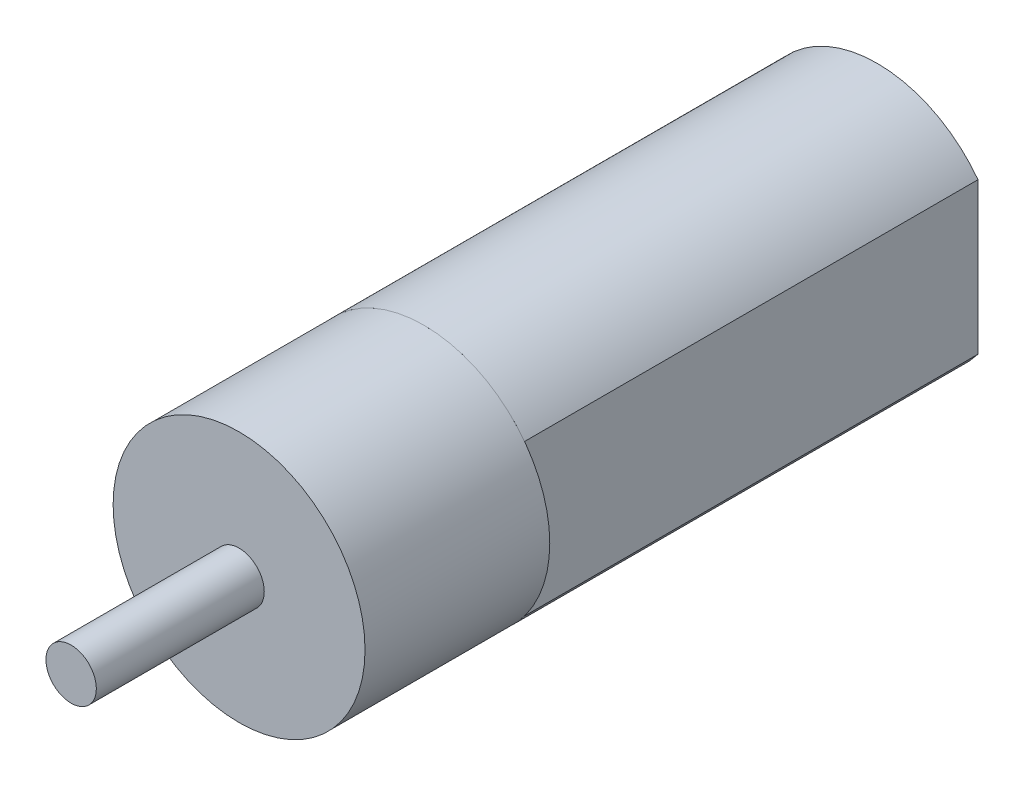
ISO-10303-21;
HEADER;
FILE_DESCRIPTION(('STEP AP214'),'2;1');
FILE_NAME('part.step','',(''),(''),'','','');
FILE_SCHEMA(('AUTOMOTIVE_DESIGN { 1 0 10303 214 1 1 1 1 }'));
ENDSEC;
DATA;
#1=APPLICATION_CONTEXT('core data for automotive mechanical design processes');
#2=APPLICATION_PROTOCOL_DEFINITION('international standard','automotive_design',2000,#1);
#3=PRODUCT_CONTEXT('',#1,'mechanical');
#4=PRODUCT('Part','Part','',(#3));
#5=PRODUCT_RELATED_PRODUCT_CATEGORY('part','',(#4));
#6=PRODUCT_DEFINITION_FORMATION('','',#4);
#7=PRODUCT_DEFINITION_CONTEXT('part definition',#1,'design');
#8=PRODUCT_DEFINITION('design','',#6,#7);
#9=PRODUCT_DEFINITION_SHAPE('','',#8);
#10=(LENGTH_UNIT() NAMED_UNIT(*) SI_UNIT(.MILLI.,.METRE.));
#11=(NAMED_UNIT(*) PLANE_ANGLE_UNIT() SI_UNIT($,.RADIAN.));
#12=(NAMED_UNIT(*) SI_UNIT($,.STERADIAN.) SOLID_ANGLE_UNIT());
#13=UNCERTAINTY_MEASURE_WITH_UNIT(LENGTH_MEASURE(1.E-05),#10,'distance_accuracy_value','');
#14=(GEOMETRIC_REPRESENTATION_CONTEXT(3) GLOBAL_UNCERTAINTY_ASSIGNED_CONTEXT((#13)) GLOBAL_UNIT_ASSIGNED_CONTEXT((#10,
#11,#12)) REPRESENTATION_CONTEXT('',''));
#15=CARTESIAN_POINT('',(0.,0.,0.));
#16=DIRECTION('',(0.,0.,1.));
#17=DIRECTION('',(1.,0.,0.));
#18=AXIS2_PLACEMENT_3D('',#15,#16,#17);
#19=CARTESIAN_POINT('',(0.,0.,-27.));
#20=DIRECTION('',(0.,0.,1.));
#21=DIRECTION('',(1.,0.,0.));
#22=AXIS2_PLACEMENT_3D('',#19,#20,#21);
#23=CYLINDRICAL_SURFACE('',#22,7.5);
#24=CARTESIAN_POINT('',(0.,0.,0.));
#25=DIRECTION('',(0.,0.,-1.));
#26=DIRECTION('',(-1.,0.,0.));
#27=AXIS2_PLACEMENT_3D('',#24,#25,#26);
#28=CIRCLE('',#27,7.5);
#29=CARTESIAN_POINT('',(6.,-4.5,0.));
#30=VERTEX_POINT('',#29);
#31=CARTESIAN_POINT('',(-6.,-4.5,0.));
#32=VERTEX_POINT('',#31);
#33=EDGE_CURVE('E115',#30,#32,#28,.T.);
#34=ORIENTED_EDGE('',*,*,#33,.T.);
#35=DIRECTION('',(0.,0.,1.));
#36=VECTOR('',#35,1.);
#37=CARTESIAN_POINT('',(-6.,-4.5,-27.));
#38=LINE('',#37,#36);
#39=CARTESIAN_POINT('',(-6.,-4.5,-27.));
#40=VERTEX_POINT('',#39);
#41=EDGE_CURVE('E12',#40,#32,#38,.T.);
#42=ORIENTED_EDGE('',*,*,#41,.F.);
#43=CARTESIAN_POINT('',(0.,0.,-27.));
#44=DIRECTION('',(0.,0.,-1.));
#45=DIRECTION('',(-1.,0.,0.));
#46=AXIS2_PLACEMENT_3D('',#43,#44,#45);
#47=CIRCLE('',#46,7.5);
#48=CARTESIAN_POINT('',(6.,-4.5,-27.));
#49=VERTEX_POINT('',#48);
#50=EDGE_CURVE('E99',#49,#40,#47,.T.);
#51=ORIENTED_EDGE('',*,*,#50,.F.);
#52=DIRECTION('',(0.,0.,1.));
#53=VECTOR('',#52,1.);
#54=CARTESIAN_POINT('',(6.,-4.5,-27.));
#55=LINE('',#54,#53);
#56=EDGE_CURVE('E111',#49,#30,#55,.T.);
#57=ORIENTED_EDGE('',*,*,#56,.T.);
#58=EDGE_LOOP('',(#34,#42,#51,#57));
#59=FACE_BOUND('',#58,.T.);
#60=ADVANCED_FACE('F47',(#59),#23,.T.);
#61=CARTESIAN_POINT('',(-6.,4.5,-27.));
#62=DIRECTION('',(1.,0.,0.));
#63=DIRECTION('',(0.,0.,-1.));
#64=AXIS2_PLACEMENT_3D('',#61,#62,#63);
#65=PLANE('',#64);
#66=DIRECTION('',(0.,1.,0.));
#67=VECTOR('',#66,1.);
#68=CARTESIAN_POINT('',(-6.,4.5,0.));
#69=LINE('',#68,#67);
#70=CARTESIAN_POINT('',(-6.,4.5,0.));
#71=VERTEX_POINT('',#70);
#72=EDGE_CURVE('E104',#32,#71,#69,.T.);
#73=ORIENTED_EDGE('',*,*,#72,.T.);
#74=DIRECTION('',(0.,0.,1.));
#75=VECTOR('',#74,1.);
#76=CARTESIAN_POINT('',(-6.,4.5,-27.));
#77=LINE('',#76,#75);
#78=CARTESIAN_POINT('',(-6.,4.5,-27.));
#79=VERTEX_POINT('',#78);
#80=EDGE_CURVE('E56',#79,#71,#77,.T.);
#81=ORIENTED_EDGE('',*,*,#80,.F.);
#82=DIRECTION('',(0.,1.,0.));
#83=VECTOR('',#82,1.);
#84=CARTESIAN_POINT('',(-6.,4.5,-27.));
#85=LINE('',#84,#83);
#86=EDGE_CURVE('E94',#40,#79,#85,.T.);
#87=ORIENTED_EDGE('',*,*,#86,.F.);
#88=ORIENTED_EDGE('',*,*,#41,.T.);
#89=EDGE_LOOP('',(#73,#81,#87,#88));
#90=FACE_BOUND('',#89,.T.);
#91=ADVANCED_FACE('F103',(#90),#65,.F.);
#92=CARTESIAN_POINT('',(0.,0.,-27.));
#93=DIRECTION('',(0.,0.,1.));
#94=DIRECTION('',(1.,0.,0.));
#95=AXIS2_PLACEMENT_3D('',#92,#93,#94);
#96=CYLINDRICAL_SURFACE('',#95,7.5);
#97=CARTESIAN_POINT('',(0.,0.,0.));
#98=DIRECTION('',(0.,0.,-1.));
#99=DIRECTION('',(-1.,0.,0.));
#100=AXIS2_PLACEMENT_3D('',#97,#98,#99);
#101=CIRCLE('',#100,7.5);
#102=CARTESIAN_POINT('',(6.,4.5,0.));
#103=VERTEX_POINT('',#102);
#104=EDGE_CURVE('E81',#71,#103,#101,.T.);
#105=ORIENTED_EDGE('',*,*,#104,.T.);
#106=DIRECTION('',(0.,0.,1.));
#107=VECTOR('',#106,1.);
#108=CARTESIAN_POINT('',(6.,4.5,-27.));
#109=LINE('',#108,#107);
#110=CARTESIAN_POINT('',(6.,4.5,-27.));
#111=VERTEX_POINT('',#110);
#112=EDGE_CURVE('E106',#111,#103,#109,.T.);
#113=ORIENTED_EDGE('',*,*,#112,.F.);
#114=CARTESIAN_POINT('',(0.,0.,-27.));
#115=DIRECTION('',(0.,0.,-1.));
#116=DIRECTION('',(-1.,0.,0.));
#117=AXIS2_PLACEMENT_3D('',#114,#115,#116);
#118=CIRCLE('',#117,7.5);
#119=EDGE_CURVE('E97',#79,#111,#118,.T.);
#120=ORIENTED_EDGE('',*,*,#119,.F.);
#121=ORIENTED_EDGE('',*,*,#80,.T.);
#122=EDGE_LOOP('',(#105,#113,#120,#121));
#123=FACE_BOUND('',#122,.T.);
#124=ADVANCED_FACE('F107',(#123),#96,.T.);
#125=CARTESIAN_POINT('',(6.,4.5,-27.));
#126=DIRECTION('',(-1.,0.,0.));
#127=DIRECTION('',(0.,0.,1.));
#128=AXIS2_PLACEMENT_3D('',#125,#126,#127);
#129=PLANE('',#128);
#130=DIRECTION('',(0.,-1.,0.));
#131=VECTOR('',#130,1.);
#132=CARTESIAN_POINT('',(6.,4.5,0.));
#133=LINE('',#132,#131);
#134=EDGE_CURVE('E87',#103,#30,#133,.T.);
#135=ORIENTED_EDGE('',*,*,#134,.T.);
#136=ORIENTED_EDGE('',*,*,#56,.F.);
#137=DIRECTION('',(0.,-1.,0.));
#138=VECTOR('',#137,1.);
#139=CARTESIAN_POINT('',(6.,4.5,-27.));
#140=LINE('',#139,#138);
#141=EDGE_CURVE('E64',#111,#49,#140,.T.);
#142=ORIENTED_EDGE('',*,*,#141,.F.);
#143=ORIENTED_EDGE('',*,*,#112,.T.);
#144=EDGE_LOOP('',(#135,#136,#142,#143));
#145=FACE_BOUND('',#144,.T.);
#146=ADVANCED_FACE('F128',(#145),#129,.F.);
#147=CARTESIAN_POINT('',(0.,0.,-27.));
#148=DIRECTION('',(0.,0.,-1.));
#149=DIRECTION('',(-1.,0.,0.));
#150=AXIS2_PLACEMENT_3D('',#147,#148,#149);
#151=PLANE('',#150);
#152=ORIENTED_EDGE('',*,*,#50,.T.);
#153=ORIENTED_EDGE('',*,*,#86,.T.);
#154=ORIENTED_EDGE('',*,*,#119,.T.);
#155=ORIENTED_EDGE('',*,*,#141,.T.);
#156=EDGE_LOOP('',(#152,#153,#154,#155));
#157=FACE_BOUND('',#156,.T.);
#158=ADVANCED_FACE('F95',(#157),#151,.T.);
#159=CARTESIAN_POINT('',(0.,0.,0.));
#160=DIRECTION('',(0.,0.,-1.));
#161=DIRECTION('',(-1.,0.,0.));
#162=AXIS2_PLACEMENT_3D('',#159,#160,#161);
#163=PLANE('',#162);
#164=ORIENTED_EDGE('',*,*,#33,.F.);
#165=ORIENTED_EDGE('',*,*,#134,.F.);
#166=ORIENTED_EDGE('',*,*,#104,.F.);
#167=ORIENTED_EDGE('',*,*,#72,.F.);
#168=EDGE_LOOP('',(#164,#165,#166,#167));
#169=FACE_BOUND('',#168,.T.);
#170=ADVANCED_FACE('F131',(#169),#163,.F.);
#171=CLOSED_SHELL('',(#60,#91,#124,#146,#158,#170));
#172=MANIFOLD_SOLID_BREP('B2',#171);
#173=CARTESIAN_POINT('',(0.,0.,11.));
#174=DIRECTION('',(0.,0.,-1.));
#175=DIRECTION('',(-1.,0.,0.));
#176=AXIS2_PLACEMENT_3D('',#173,#174,#175);
#177=CYLINDRICAL_SURFACE('',#176,7.5);
#178=CARTESIAN_POINT('',(0.,0.,11.));
#179=DIRECTION('',(0.,0.,1.));
#180=DIRECTION('',(1.,0.,0.));
#181=AXIS2_PLACEMENT_3D('',#178,#179,#180);
#182=CIRCLE('',#181,7.5);
#183=CARTESIAN_POINT('',(7.5,0.,11.));
#184=VERTEX_POINT('',#183);
#185=EDGE_CURVE('E190',#184,#184,#182,.T.);
#186=ORIENTED_EDGE('',*,*,#185,.F.);
#187=EDGE_LOOP('',(#186));
#188=FACE_BOUND('',#187,.T.);
#189=CARTESIAN_POINT('',(0.,0.,0.));
#190=DIRECTION('',(0.,0.,1.));
#191=DIRECTION('',(1.,0.,0.));
#192=AXIS2_PLACEMENT_3D('',#189,#190,#191);
#193=CIRCLE('',#192,7.5);
#194=CARTESIAN_POINT('',(7.5,0.,0.));
#195=VERTEX_POINT('',#194);
#196=EDGE_CURVE('E186',#195,#195,#193,.T.);
#197=ORIENTED_EDGE('',*,*,#196,.T.);
#198=EDGE_LOOP('',(#197));
#199=FACE_BOUND('',#198,.T.);
#200=ADVANCED_FACE('F183',(#188,#199),#177,.T.);
#201=CARTESIAN_POINT('',(0.,0.,11.));
#202=DIRECTION('',(0.,0.,1.));
#203=DIRECTION('',(1.,0.,0.));
#204=AXIS2_PLACEMENT_3D('',#201,#202,#203);
#205=PLANE('',#204);
#206=CARTESIAN_POINT('',(0.,0.,11.));
#207=DIRECTION('',(0.,0.,1.));
#208=DIRECTION('',(1.,0.,0.));
#209=AXIS2_PLACEMENT_3D('',#206,#207,#208);
#210=CIRCLE('',#209,1.5);
#211=CARTESIAN_POINT('',(1.5,0.,11.));
#212=VERTEX_POINT('',#211);
#213=EDGE_CURVE('E46',#212,#212,#210,.T.);
#214=ORIENTED_EDGE('',*,*,#213,.F.);
#215=EDGE_LOOP('',(#214));
#216=FACE_BOUND('',#215,.T.);
#217=ORIENTED_EDGE('',*,*,#185,.T.);
#218=EDGE_LOOP('',(#217));
#219=FACE_BOUND('',#218,.T.);
#220=ADVANCED_FACE('F207',(#216,#219),#205,.T.);
#221=CARTESIAN_POINT('',(0.,0.,0.));
#222=DIRECTION('',(0.,0.,1.));
#223=DIRECTION('',(1.,0.,0.));
#224=AXIS2_PLACEMENT_3D('',#221,#222,#223);
#225=PLANE('',#224);
#226=ORIENTED_EDGE('',*,*,#196,.F.);
#227=EDGE_LOOP('',(#226));
#228=FACE_BOUND('',#227,.T.);
#229=ADVANCED_FACE('F204',(#228),#225,.F.);
#230=CARTESIAN_POINT('',(0.,0.,21.));
#231=DIRECTION('',(0.,0.,-1.));
#232=DIRECTION('',(-1.,0.,0.));
#233=AXIS2_PLACEMENT_3D('',#230,#231,#232);
#234=CYLINDRICAL_SURFACE('',#233,1.5);
#235=CARTESIAN_POINT('',(0.,0.,21.));
#236=DIRECTION('',(0.,0.,1.));
#237=DIRECTION('',(1.,0.,0.));
#238=AXIS2_PLACEMENT_3D('',#235,#236,#237);
#239=CIRCLE('',#238,1.5);
#240=CARTESIAN_POINT('',(1.5,0.,21.));
#241=VERTEX_POINT('',#240);
#242=EDGE_CURVE('E196',#241,#241,#239,.T.);
#243=ORIENTED_EDGE('',*,*,#242,.F.);
#244=EDGE_LOOP('',(#243));
#245=FACE_BOUND('',#244,.T.);
#246=ORIENTED_EDGE('',*,*,#213,.T.);
#247=EDGE_LOOP('',(#246));
#248=FACE_BOUND('',#247,.T.);
#249=ADVANCED_FACE('F206',(#245,#248),#234,.T.);
#250=CARTESIAN_POINT('',(0.,0.,21.));
#251=DIRECTION('',(0.,0.,1.));
#252=DIRECTION('',(1.,0.,0.));
#253=AXIS2_PLACEMENT_3D('',#250,#251,#252);
#254=PLANE('',#253);
#255=ORIENTED_EDGE('',*,*,#242,.T.);
#256=EDGE_LOOP('',(#255));
#257=FACE_BOUND('',#256,.T.);
#258=ADVANCED_FACE('F212',(#257),#254,.T.);
#259=CLOSED_SHELL('',(#200,#220,#229,#249,#258));
#260=MANIFOLD_SOLID_BREP('B6',#259);
#261=ADVANCED_BREP_SHAPE_REPRESENTATION('',(#18,#172,#260),#14);
#262=SHAPE_DEFINITION_REPRESENTATION(#9,#261);
ENDSEC;
END-ISO-10303-21;
